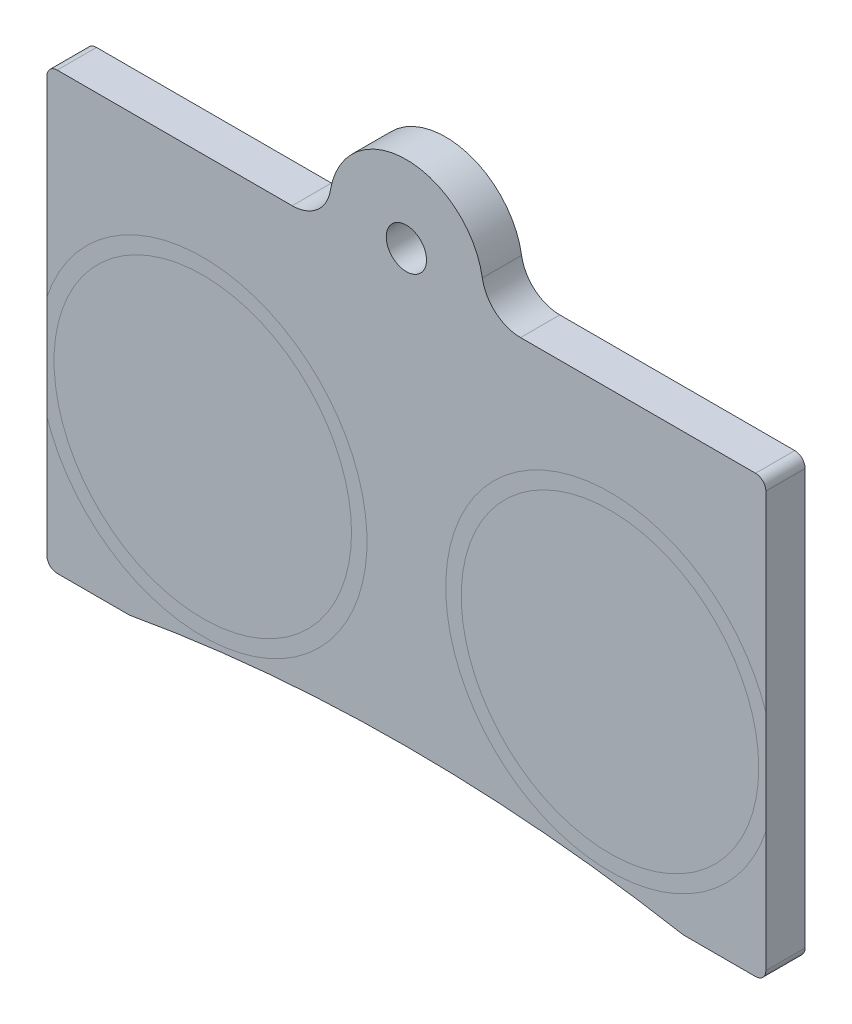
ISO-10303-21;
HEADER;
FILE_DESCRIPTION(('STEP AP214'),'2;1');
FILE_NAME('part.step','',(''),(''),'','','');
FILE_SCHEMA(('AUTOMOTIVE_DESIGN { 1 0 10303 214 1 1 1 1 }'));
ENDSEC;
DATA;
#1=APPLICATION_CONTEXT('core data for automotive mechanical design processes');
#2=APPLICATION_PROTOCOL_DEFINITION('international standard','automotive_design',2000,#1);
#3=PRODUCT_CONTEXT('',#1,'mechanical');
#4=PRODUCT('Part','Part','',(#3));
#5=PRODUCT_RELATED_PRODUCT_CATEGORY('part','',(#4));
#6=PRODUCT_DEFINITION_FORMATION('','',#4);
#7=PRODUCT_DEFINITION_CONTEXT('part definition',#1,'design');
#8=PRODUCT_DEFINITION('design','',#6,#7);
#9=PRODUCT_DEFINITION_SHAPE('','',#8);
#10=(LENGTH_UNIT() NAMED_UNIT(*) SI_UNIT(.MILLI.,.METRE.));
#11=(NAMED_UNIT(*) PLANE_ANGLE_UNIT() SI_UNIT($,.RADIAN.));
#12=(NAMED_UNIT(*) SI_UNIT($,.STERADIAN.) SOLID_ANGLE_UNIT());
#13=UNCERTAINTY_MEASURE_WITH_UNIT(LENGTH_MEASURE(1.E-05),#10,'distance_accuracy_value','');
#14=(GEOMETRIC_REPRESENTATION_CONTEXT(3) GLOBAL_UNCERTAINTY_ASSIGNED_CONTEXT((#13)) GLOBAL_UNIT_ASSIGNED_CONTEXT((#10,
#11,#12)) REPRESENTATION_CONTEXT('',''));
#15=CARTESIAN_POINT('',(0.,0.,0.));
#16=DIRECTION('',(0.,0.,1.));
#17=DIRECTION('',(1.,0.,0.));
#18=AXIS2_PLACEMENT_3D('',#15,#16,#17);
#19=CARTESIAN_POINT('',(-33.8,-43.15,3.8));
#20=DIRECTION('',(0.,0.,1.));
#21=DIRECTION('',(1.,0.,0.));
#22=AXIS2_PLACEMENT_3D('',#19,#20,#21);
#23=PLANE('',#22);
#24=CARTESIAN_POINT('',(0.,0.,3.8));
#25=DIRECTION('',(0.,0.,1.));
#26=DIRECTION('',(1.,0.,0.));
#27=AXIS2_PLACEMENT_3D('',#24,#25,#26);
#28=CIRCLE('',#27,1.95);
#29=CARTESIAN_POINT('',(-1.95,0.,3.8));
#30=VERTEX_POINT('',#29);
#31=EDGE_CURVE('E217',#30,#30,#28,.T.);
#32=ORIENTED_EDGE('',*,*,#31,.F.);
#33=EDGE_LOOP('',(#32));
#34=FACE_BOUND('',#33,.T.);
#35=DIRECTION('',(0.,-1.,0.));
#36=VECTOR('',#35,1.);
#37=CARTESIAN_POINT('',(-34.8,-2.95000000000001,3.8));
#38=LINE('',#37,#36);
#39=CARTESIAN_POINT('',(-34.8,-2.95000000000001,3.8));
#40=VERTEX_POINT('',#39);
#41=CARTESIAN_POINT('',(-34.8,-21.4756703439927,3.8));
#42=VERTEX_POINT('',#41);
#43=EDGE_CURVE('E255',#40,#42,#38,.T.);
#44=ORIENTED_EDGE('',*,*,#43,.T.);
#45=CARTESIAN_POINT('',(-19.71,-26.4858499814908,3.8));
#46=DIRECTION('',(0.,0.,1.));
#47=DIRECTION('',(1.,0.,0.));
#48=AXIS2_PLACEMENT_3D('',#45,#46,#47);
#49=CIRCLE('',#48,15.9);
#50=CARTESIAN_POINT('',(-34.8,-31.4960296189888,3.8));
#51=VERTEX_POINT('',#50);
#52=EDGE_CURVE('E11',#42,#51,#49,.F.);
#53=ORIENTED_EDGE('',*,*,#52,.T.);
#54=CARTESIAN_POINT('',(-34.8,-43.15,3.8));
#55=VERTEX_POINT('',#54);
#56=EDGE_CURVE('E166',#51,#55,#38,.T.);
#57=ORIENTED_EDGE('',*,*,#56,.T.);
#58=CARTESIAN_POINT('',(-33.8,-43.15,3.8));
#59=DIRECTION('',(0.,0.,1.));
#60=DIRECTION('',(1.,0.,0.));
#61=AXIS2_PLACEMENT_3D('',#58,#59,#60);
#62=CIRCLE('',#61,1.);
#63=CARTESIAN_POINT('',(-33.8,-44.15,3.8));
#64=VERTEX_POINT('',#63);
#65=EDGE_CURVE('E163',#55,#64,#62,.T.);
#66=ORIENTED_EDGE('',*,*,#65,.T.);
#67=DIRECTION('',(1.,0.,0.));
#68=VECTOR('',#67,1.);
#69=CARTESIAN_POINT('',(-33.8,-44.15,3.8));
#70=LINE('',#69,#68);
#71=CARTESIAN_POINT('',(-26.8,-44.15,3.8));
#72=VERTEX_POINT('',#71);
#73=EDGE_CURVE('E153',#64,#72,#70,.T.);
#74=ORIENTED_EDGE('',*,*,#73,.T.);
#75=CARTESIAN_POINT('',(0.,-192.583333333334,3.8));
#76=DIRECTION('',(0.,0.,-1.));
#77=DIRECTION('',(-1.,0.,0.));
#78=AXIS2_PLACEMENT_3D('',#75,#76,#77);
#79=CIRCLE('',#78,150.833333333334);
#80=CARTESIAN_POINT('',(26.8,-44.15,3.8));
#81=VERTEX_POINT('',#80);
#82=EDGE_CURVE('E162',#72,#81,#79,.T.);
#83=ORIENTED_EDGE('',*,*,#82,.T.);
#84=DIRECTION('',(1.,0.,0.));
#85=VECTOR('',#84,1.);
#86=CARTESIAN_POINT('',(26.8,-44.15,3.8));
#87=LINE('',#86,#85);
#88=CARTESIAN_POINT('',(33.8,-44.15,3.8));
#89=VERTEX_POINT('',#88);
#90=EDGE_CURVE('E231',#81,#89,#87,.T.);
#91=ORIENTED_EDGE('',*,*,#90,.T.);
#92=CARTESIAN_POINT('',(33.8,-43.15,3.8));
#93=DIRECTION('',(0.,0.,1.));
#94=DIRECTION('',(1.,0.,0.));
#95=AXIS2_PLACEMENT_3D('',#92,#93,#94);
#96=CIRCLE('',#95,1.);
#97=CARTESIAN_POINT('',(34.8,-43.15,3.8));
#98=VERTEX_POINT('',#97);
#99=EDGE_CURVE('E233',#89,#98,#96,.T.);
#100=ORIENTED_EDGE('',*,*,#99,.T.);
#101=DIRECTION('',(0.,1.,0.));
#102=VECTOR('',#101,1.);
#103=CARTESIAN_POINT('',(34.8,-2.95000000000001,3.8));
#104=LINE('',#103,#102);
#105=CARTESIAN_POINT('',(34.8,-31.4960296189888,3.8));
#106=VERTEX_POINT('',#105);
#107=EDGE_CURVE('E236',#98,#106,#104,.T.);
#108=ORIENTED_EDGE('',*,*,#107,.T.);
#109=CARTESIAN_POINT('',(19.71,-26.4858499814908,3.8));
#110=DIRECTION('',(0.,0.,1.));
#111=DIRECTION('',(1.,0.,0.));
#112=AXIS2_PLACEMENT_3D('',#109,#110,#111);
#113=CIRCLE('',#112,15.9);
#114=CARTESIAN_POINT('',(34.8,-21.4756703439927,3.8));
#115=VERTEX_POINT('',#114);
#116=EDGE_CURVE('E174',#106,#115,#113,.F.);
#117=ORIENTED_EDGE('',*,*,#116,.T.);
#118=CARTESIAN_POINT('',(34.8,-2.95000000000001,3.8));
#119=VERTEX_POINT('',#118);
#120=EDGE_CURVE('E235',#115,#119,#104,.T.);
#121=ORIENTED_EDGE('',*,*,#120,.T.);
#122=CARTESIAN_POINT('',(33.8,-2.95,3.8));
#123=DIRECTION('',(0.,0.,1.));
#124=DIRECTION('',(-1.,0.,0.));
#125=AXIS2_PLACEMENT_3D('',#122,#123,#124);
#126=CIRCLE('',#125,1.);
#127=CARTESIAN_POINT('',(33.8,-1.95,3.8));
#128=VERTEX_POINT('',#127);
#129=EDGE_CURVE('E239',#119,#128,#126,.T.);
#130=ORIENTED_EDGE('',*,*,#129,.T.);
#131=DIRECTION('',(-1.,0.,0.));
#132=VECTOR('',#131,1.);
#133=CARTESIAN_POINT('',(11.0544108843484,-1.95,3.8));
#134=LINE('',#133,#132);
#135=CARTESIAN_POINT('',(11.0544108843484,-1.95,3.8));
#136=VERTEX_POINT('',#135);
#137=EDGE_CURVE('E242',#128,#136,#134,.T.);
#138=ORIENTED_EDGE('',*,*,#137,.T.);
#139=CARTESIAN_POINT('',(11.0544108843484,1.8,3.8));
#140=DIRECTION('',(0.,0.,-1.));
#141=DIRECTION('',(1.,0.,0.));
#142=AXIS2_PLACEMENT_3D('',#139,#140,#141);
#143=CIRCLE('',#142,3.75);
#144=CARTESIAN_POINT('',(7.35315724003531,1.19732142857143,3.8));
#145=VERTEX_POINT('',#144);
#146=EDGE_CURVE('E245',#136,#145,#143,.T.);
#147=ORIENTED_EDGE('',*,*,#146,.T.);
#148=CARTESIAN_POINT('',(0.,0.,3.8));
#149=DIRECTION('',(0.,0.,1.));
#150=DIRECTION('',(1.,0.,0.));
#151=AXIS2_PLACEMENT_3D('',#148,#149,#150);
#152=CIRCLE('',#151,7.45);
#153=CARTESIAN_POINT('',(-7.35315724003531,1.19732142857143,3.8));
#154=VERTEX_POINT('',#153);
#155=EDGE_CURVE('E247',#145,#154,#152,.T.);
#156=ORIENTED_EDGE('',*,*,#155,.T.);
#157=CARTESIAN_POINT('',(-11.0544108843484,1.8,3.8));
#158=DIRECTION('',(0.,0.,-1.));
#159=DIRECTION('',(-1.,0.,0.));
#160=AXIS2_PLACEMENT_3D('',#157,#158,#159);
#161=CIRCLE('',#160,3.75);
#162=CARTESIAN_POINT('',(-11.0544108843484,-1.95,3.8));
#163=VERTEX_POINT('',#162);
#164=EDGE_CURVE('E249',#154,#163,#161,.T.);
#165=ORIENTED_EDGE('',*,*,#164,.T.);
#166=DIRECTION('',(-1.,0.,0.));
#167=VECTOR('',#166,1.);
#168=CARTESIAN_POINT('',(-33.8,-1.95,3.8));
#169=LINE('',#168,#167);
#170=CARTESIAN_POINT('',(-33.8,-1.95,3.8));
#171=VERTEX_POINT('',#170);
#172=EDGE_CURVE('E251',#163,#171,#169,.T.);
#173=ORIENTED_EDGE('',*,*,#172,.T.);
#174=CARTESIAN_POINT('',(-33.8,-2.95,3.8));
#175=DIRECTION('',(0.,0.,1.));
#176=DIRECTION('',(1.,0.,0.));
#177=AXIS2_PLACEMENT_3D('',#174,#175,#176);
#178=CIRCLE('',#177,1.);
#179=EDGE_CURVE('E253',#171,#40,#178,.T.);
#180=ORIENTED_EDGE('',*,*,#179,.T.);
#181=EDGE_LOOP('',(#44,#53,#57,#66,#74,#83,#91,#100,#108,#117,#121,#130,#138,#147,#156,#165,
#173,#180));
#182=FACE_BOUND('',#181,.T.);
#183=ADVANCED_FACE('F42',(#34,#182),#23,.T.);
#184=ORIENTED_EDGE('',*,*,#116,.F.);
#185=EDGE_CURVE('E240',#106,#115,#104,.T.);
#186=ORIENTED_EDGE('',*,*,#185,.T.);
#187=EDGE_LOOP('',(#184,#186));
#188=FACE_BOUND('',#187,.T.);
#189=CARTESIAN_POINT('',(19.71,-26.4858499814908,3.8));
#190=DIRECTION('',(0.,0.,1.));
#191=DIRECTION('',(1.,0.,0.));
#192=AXIS2_PLACEMENT_3D('',#189,#190,#191);
#193=CIRCLE('',#192,14.400000029);
#194=CARTESIAN_POINT('',(34.110000029,-26.4858499814908,3.8));
#195=VERTEX_POINT('',#194);
#196=EDGE_CURVE('E51',#195,#195,#193,.F.);
#197=ORIENTED_EDGE('',*,*,#196,.T.);
#198=EDGE_LOOP('',(#197));
#199=FACE_BOUND('',#198,.T.);
#200=ADVANCED_FACE('F193',(#188,#199),#23,.T.);
#201=ORIENTED_EDGE('',*,*,#52,.F.);
#202=EDGE_CURVE('E257',#42,#51,#38,.T.);
#203=ORIENTED_EDGE('',*,*,#202,.T.);
#204=EDGE_LOOP('',(#201,#203));
#205=FACE_BOUND('',#204,.T.);
#206=CARTESIAN_POINT('',(-19.71,-26.4858499814908,3.8));
#207=DIRECTION('',(0.,0.,1.));
#208=DIRECTION('',(1.,0.,0.));
#209=AXIS2_PLACEMENT_3D('',#206,#207,#208);
#210=CIRCLE('',#209,14.400000029);
#211=CARTESIAN_POINT('',(-5.309999971,-26.4858499814908,3.8));
#212=VERTEX_POINT('',#211);
#213=EDGE_CURVE('E177',#212,#212,#210,.F.);
#214=ORIENTED_EDGE('',*,*,#213,.T.);
#215=EDGE_LOOP('',(#214));
#216=FACE_BOUND('',#215,.T.);
#217=ADVANCED_FACE('F206',(#205,#216),#23,.T.);
#218=ORIENTED_EDGE('',*,*,#213,.F.);
#219=EDGE_LOOP('',(#218));
#220=FACE_BOUND('',#219,.T.);
#221=ADVANCED_FACE('F198',(#220),#23,.T.);
#222=ORIENTED_EDGE('',*,*,#196,.F.);
#223=EDGE_LOOP('',(#222));
#224=FACE_BOUND('',#223,.T.);
#225=ADVANCED_FACE('F195',(#224),#23,.T.);
#226=CARTESIAN_POINT('',(-33.8,-43.15,0.));
#227=DIRECTION('',(0.,0.,1.));
#228=DIRECTION('',(1.,0.,0.));
#229=AXIS2_PLACEMENT_3D('',#226,#227,#228);
#230=PLANE('',#229);
#231=CARTESIAN_POINT('',(-33.8,-43.15,0.));
#232=DIRECTION('',(0.,0.,1.));
#233=DIRECTION('',(1.,0.,0.));
#234=AXIS2_PLACEMENT_3D('',#231,#232,#233);
#235=CIRCLE('',#234,1.);
#236=CARTESIAN_POINT('',(-34.8,-43.15,0.));
#237=VERTEX_POINT('',#236);
#238=CARTESIAN_POINT('',(-33.8,-44.15,0.));
#239=VERTEX_POINT('',#238);
#240=EDGE_CURVE('E173',#237,#239,#235,.T.);
#241=ORIENTED_EDGE('',*,*,#240,.F.);
#242=DIRECTION('',(0.,-1.,0.));
#243=VECTOR('',#242,1.);
#244=CARTESIAN_POINT('',(-34.8,-2.95000000000001,0.));
#245=LINE('',#244,#243);
#246=CARTESIAN_POINT('',(-34.8,-2.95000000000001,0.));
#247=VERTEX_POINT('',#246);
#248=EDGE_CURVE('E170',#247,#237,#245,.T.);
#249=ORIENTED_EDGE('',*,*,#248,.F.);
#250=CARTESIAN_POINT('',(-33.8,-2.95,0.));
#251=DIRECTION('',(0.,0.,1.));
#252=DIRECTION('',(1.,0.,0.));
#253=AXIS2_PLACEMENT_3D('',#250,#251,#252);
#254=CIRCLE('',#253,1.);
#255=CARTESIAN_POINT('',(-33.8,-1.95,0.));
#256=VERTEX_POINT('',#255);
#257=EDGE_CURVE('E281',#256,#247,#254,.T.);
#258=ORIENTED_EDGE('',*,*,#257,.F.);
#259=DIRECTION('',(-1.,0.,0.));
#260=VECTOR('',#259,1.);
#261=CARTESIAN_POINT('',(-33.8,-1.95,0.));
#262=LINE('',#261,#260);
#263=CARTESIAN_POINT('',(-11.0544108843484,-1.95,0.));
#264=VERTEX_POINT('',#263);
#265=EDGE_CURVE('E279',#264,#256,#262,.T.);
#266=ORIENTED_EDGE('',*,*,#265,.F.);
#267=CARTESIAN_POINT('',(-11.0544108843484,1.8,0.));
#268=DIRECTION('',(0.,0.,-1.));
#269=DIRECTION('',(-1.,0.,0.));
#270=AXIS2_PLACEMENT_3D('',#267,#268,#269);
#271=CIRCLE('',#270,3.75);
#272=CARTESIAN_POINT('',(-7.35315724003531,1.19732142857143,0.));
#273=VERTEX_POINT('',#272);
#274=EDGE_CURVE('E277',#273,#264,#271,.T.);
#275=ORIENTED_EDGE('',*,*,#274,.F.);
#276=CARTESIAN_POINT('',(0.,0.,0.));
#277=DIRECTION('',(0.,0.,1.));
#278=DIRECTION('',(1.,0.,0.));
#279=AXIS2_PLACEMENT_3D('',#276,#277,#278);
#280=CIRCLE('',#279,7.45);
#281=CARTESIAN_POINT('',(7.35315724003531,1.19732142857143,0.));
#282=VERTEX_POINT('',#281);
#283=EDGE_CURVE('E275',#282,#273,#280,.T.);
#284=ORIENTED_EDGE('',*,*,#283,.F.);
#285=CARTESIAN_POINT('',(11.0544108843484,1.8,0.));
#286=DIRECTION('',(0.,0.,-1.));
#287=DIRECTION('',(1.,0.,0.));
#288=AXIS2_PLACEMENT_3D('',#285,#286,#287);
#289=CIRCLE('',#288,3.75);
#290=CARTESIAN_POINT('',(11.0544108843484,-1.95,0.));
#291=VERTEX_POINT('',#290);
#292=EDGE_CURVE('E273',#291,#282,#289,.T.);
#293=ORIENTED_EDGE('',*,*,#292,.F.);
#294=DIRECTION('',(-1.,0.,0.));
#295=VECTOR('',#294,1.);
#296=CARTESIAN_POINT('',(11.0544108843484,-1.95,0.));
#297=LINE('',#296,#295);
#298=CARTESIAN_POINT('',(33.8,-1.95,0.));
#299=VERTEX_POINT('',#298);
#300=EDGE_CURVE('E271',#299,#291,#297,.T.);
#301=ORIENTED_EDGE('',*,*,#300,.F.);
#302=CARTESIAN_POINT('',(33.8,-2.95,0.));
#303=DIRECTION('',(0.,0.,1.));
#304=DIRECTION('',(-1.,0.,0.));
#305=AXIS2_PLACEMENT_3D('',#302,#303,#304);
#306=CIRCLE('',#305,1.);
#307=CARTESIAN_POINT('',(34.8,-2.95000000000001,0.));
#308=VERTEX_POINT('',#307);
#309=EDGE_CURVE('E269',#308,#299,#306,.T.);
#310=ORIENTED_EDGE('',*,*,#309,.F.);
#311=DIRECTION('',(0.,1.,0.));
#312=VECTOR('',#311,1.);
#313=CARTESIAN_POINT('',(34.8,-2.95000000000001,0.));
#314=LINE('',#313,#312);
#315=CARTESIAN_POINT('',(34.8,-43.15,0.));
#316=VERTEX_POINT('',#315);
#317=EDGE_CURVE('E267',#316,#308,#314,.T.);
#318=ORIENTED_EDGE('',*,*,#317,.F.);
#319=CARTESIAN_POINT('',(33.8,-43.15,0.));
#320=DIRECTION('',(0.,0.,1.));
#321=DIRECTION('',(1.,0.,0.));
#322=AXIS2_PLACEMENT_3D('',#319,#320,#321);
#323=CIRCLE('',#322,1.);
#324=CARTESIAN_POINT('',(33.8,-44.15,0.));
#325=VERTEX_POINT('',#324);
#326=EDGE_CURVE('E265',#325,#316,#323,.T.);
#327=ORIENTED_EDGE('',*,*,#326,.F.);
#328=DIRECTION('',(1.,0.,0.));
#329=VECTOR('',#328,1.);
#330=CARTESIAN_POINT('',(26.8,-44.15,0.));
#331=LINE('',#330,#329);
#332=CARTESIAN_POINT('',(26.8,-44.15,0.));
#333=VERTEX_POINT('',#332);
#334=EDGE_CURVE('E263',#333,#325,#331,.T.);
#335=ORIENTED_EDGE('',*,*,#334,.F.);
#336=CARTESIAN_POINT('',(0.,-192.583333333334,0.));
#337=DIRECTION('',(0.,0.,-1.));
#338=DIRECTION('',(-1.,0.,0.));
#339=AXIS2_PLACEMENT_3D('',#336,#337,#338);
#340=CIRCLE('',#339,150.833333333334);
#341=CARTESIAN_POINT('',(-26.8,-44.15,0.));
#342=VERTEX_POINT('',#341);
#343=EDGE_CURVE('E260',#342,#333,#340,.T.);
#344=ORIENTED_EDGE('',*,*,#343,.F.);
#345=DIRECTION('',(1.,0.,0.));
#346=VECTOR('',#345,1.);
#347=CARTESIAN_POINT('',(-33.8,-44.15,0.));
#348=LINE('',#347,#346);
#349=EDGE_CURVE('E224',#239,#342,#348,.T.);
#350=ORIENTED_EDGE('',*,*,#349,.F.);
#351=EDGE_LOOP('',(#241,#249,#258,#266,#275,#284,#293,#301,#310,#318,#327,#335,#344,#350));
#352=FACE_BOUND('',#351,.T.);
#353=CARTESIAN_POINT('',(0.,0.,0.));
#354=DIRECTION('',(0.,0.,1.));
#355=DIRECTION('',(1.,0.,0.));
#356=AXIS2_PLACEMENT_3D('',#353,#354,#355);
#357=CIRCLE('',#356,1.95);
#358=CARTESIAN_POINT('',(-1.95,0.,0.));
#359=VERTEX_POINT('',#358);
#360=EDGE_CURVE('E220',#359,#359,#357,.T.);
#361=ORIENTED_EDGE('',*,*,#360,.T.);
#362=EDGE_LOOP('',(#361));
#363=FACE_BOUND('',#362,.T.);
#364=ADVANCED_FACE('F197',(#352,#363),#230,.F.);
#365=CARTESIAN_POINT('',(-33.8,-43.15,3.8));
#366=DIRECTION('',(0.,0.,-1.));
#367=DIRECTION('',(-1.,0.,0.));
#368=AXIS2_PLACEMENT_3D('',#365,#366,#367);
#369=CYLINDRICAL_SURFACE('',#368,1.);
#370=ORIENTED_EDGE('',*,*,#240,.T.);
#371=DIRECTION('',(0.,0.,-1.));
#372=VECTOR('',#371,1.);
#373=CARTESIAN_POINT('',(-33.8,-44.15,3.8));
#374=LINE('',#373,#372);
#375=EDGE_CURVE('E157',#64,#239,#374,.T.);
#376=ORIENTED_EDGE('',*,*,#375,.F.);
#377=ORIENTED_EDGE('',*,*,#65,.F.);
#378=DIRECTION('',(0.,0.,-1.));
#379=VECTOR('',#378,1.);
#380=CARTESIAN_POINT('',(-34.8,-43.15,3.8));
#381=LINE('',#380,#379);
#382=EDGE_CURVE('E256',#55,#237,#381,.T.);
#383=ORIENTED_EDGE('',*,*,#382,.T.);
#384=EDGE_LOOP('',(#370,#376,#377,#383));
#385=FACE_BOUND('',#384,.T.);
#386=ADVANCED_FACE('F44',(#385),#369,.T.);
#387=CARTESIAN_POINT('',(-33.8,-44.15,3.8));
#388=DIRECTION('',(0.,1.,0.));
#389=DIRECTION('',(0.,0.,1.));
#390=AXIS2_PLACEMENT_3D('',#387,#388,#389);
#391=PLANE('',#390);
#392=ORIENTED_EDGE('',*,*,#349,.T.);
#393=DIRECTION('',(0.,0.,-1.));
#394=VECTOR('',#393,1.);
#395=CARTESIAN_POINT('',(-26.8,-44.15,3.8));
#396=LINE('',#395,#394);
#397=EDGE_CURVE('E160',#72,#342,#396,.T.);
#398=ORIENTED_EDGE('',*,*,#397,.F.);
#399=ORIENTED_EDGE('',*,*,#73,.F.);
#400=ORIENTED_EDGE('',*,*,#375,.T.);
#401=EDGE_LOOP('',(#392,#398,#399,#400));
#402=FACE_BOUND('',#401,.T.);
#403=ADVANCED_FACE('F155',(#402),#391,.F.);
#404=CARTESIAN_POINT('',(0.,-192.583333333334,3.8));
#405=DIRECTION('',(0.,0.,-1.));
#406=DIRECTION('',(-1.,0.,0.));
#407=AXIS2_PLACEMENT_3D('',#404,#405,#406);
#408=CYLINDRICAL_SURFACE('',#407,150.833333333334);
#409=ORIENTED_EDGE('',*,*,#343,.T.);
#410=DIRECTION('',(0.,0.,-1.));
#411=VECTOR('',#410,1.);
#412=CARTESIAN_POINT('',(26.8,-44.15,3.8));
#413=LINE('',#412,#411);
#414=EDGE_CURVE('E179',#81,#333,#413,.T.);
#415=ORIENTED_EDGE('',*,*,#414,.F.);
#416=ORIENTED_EDGE('',*,*,#82,.F.);
#417=ORIENTED_EDGE('',*,*,#397,.T.);
#418=EDGE_LOOP('',(#409,#415,#416,#417));
#419=FACE_BOUND('',#418,.T.);
#420=ADVANCED_FACE('F338',(#419),#408,.F.);
#421=CARTESIAN_POINT('',(26.8,-44.15,3.8));
#422=DIRECTION('',(0.,1.,0.));
#423=DIRECTION('',(-1.,0.,0.));
#424=AXIS2_PLACEMENT_3D('',#421,#422,#423);
#425=PLANE('',#424);
#426=ORIENTED_EDGE('',*,*,#334,.T.);
#427=DIRECTION('',(0.,0.,-1.));
#428=VECTOR('',#427,1.);
#429=CARTESIAN_POINT('',(33.8,-44.15,3.8));
#430=LINE('',#429,#428);
#431=EDGE_CURVE('E312',#89,#325,#430,.T.);
#432=ORIENTED_EDGE('',*,*,#431,.F.);
#433=ORIENTED_EDGE('',*,*,#90,.F.);
#434=ORIENTED_EDGE('',*,*,#414,.T.);
#435=EDGE_LOOP('',(#426,#432,#433,#434));
#436=FACE_BOUND('',#435,.T.);
#437=ADVANCED_FACE('F319',(#436),#425,.F.);
#438=CARTESIAN_POINT('',(33.8,-43.15,3.8));
#439=DIRECTION('',(0.,0.,-1.));
#440=DIRECTION('',(-1.,0.,0.));
#441=AXIS2_PLACEMENT_3D('',#438,#439,#440);
#442=CYLINDRICAL_SURFACE('',#441,1.);
#443=ORIENTED_EDGE('',*,*,#326,.T.);
#444=DIRECTION('',(0.,0.,-1.));
#445=VECTOR('',#444,1.);
#446=CARTESIAN_POINT('',(34.8,-43.15,3.8));
#447=LINE('',#446,#445);
#448=EDGE_CURVE('E309',#98,#316,#447,.T.);
#449=ORIENTED_EDGE('',*,*,#448,.F.);
#450=ORIENTED_EDGE('',*,*,#99,.F.);
#451=ORIENTED_EDGE('',*,*,#431,.T.);
#452=EDGE_LOOP('',(#443,#449,#450,#451));
#453=FACE_BOUND('',#452,.T.);
#454=ADVANCED_FACE('F329',(#453),#442,.T.);
#455=CARTESIAN_POINT('',(34.8,-2.95000000000001,3.8));
#456=DIRECTION('',(-1.,0.,0.));
#457=DIRECTION('',(0.,-1.,0.));
#458=AXIS2_PLACEMENT_3D('',#455,#456,#457);
#459=PLANE('',#458);
#460=ORIENTED_EDGE('',*,*,#317,.T.);
#461=DIRECTION('',(0.,0.,-1.));
#462=VECTOR('',#461,1.);
#463=CARTESIAN_POINT('',(34.8,-2.95000000000001,3.8));
#464=LINE('',#463,#462);
#465=EDGE_CURVE('E306',#119,#308,#464,.T.);
#466=ORIENTED_EDGE('',*,*,#465,.F.);
#467=ORIENTED_EDGE('',*,*,#120,.F.);
#468=ORIENTED_EDGE('',*,*,#185,.F.);
#469=ORIENTED_EDGE('',*,*,#107,.F.);
#470=ORIENTED_EDGE('',*,*,#448,.T.);
#471=EDGE_LOOP('',(#460,#466,#467,#468,#469,#470));
#472=FACE_BOUND('',#471,.T.);
#473=ADVANCED_FACE('F333',(#472),#459,.F.);
#474=CARTESIAN_POINT('',(33.8,-2.95,3.8));
#475=DIRECTION('',(0.,0.,-1.));
#476=DIRECTION('',(-1.,0.,0.));
#477=AXIS2_PLACEMENT_3D('',#474,#475,#476);
#478=CYLINDRICAL_SURFACE('',#477,1.);
#479=ORIENTED_EDGE('',*,*,#309,.T.);
#480=DIRECTION('',(0.,0.,-1.));
#481=VECTOR('',#480,1.);
#482=CARTESIAN_POINT('',(33.8,-1.95,3.8));
#483=LINE('',#482,#481);
#484=EDGE_CURVE('E303',#128,#299,#483,.T.);
#485=ORIENTED_EDGE('',*,*,#484,.F.);
#486=ORIENTED_EDGE('',*,*,#129,.F.);
#487=ORIENTED_EDGE('',*,*,#465,.T.);
#488=EDGE_LOOP('',(#479,#485,#486,#487));
#489=FACE_BOUND('',#488,.T.);
#490=ADVANCED_FACE('F351',(#489),#478,.T.);
#491=CARTESIAN_POINT('',(11.0544108843484,-1.95,3.8));
#492=DIRECTION('',(0.,-1.,0.));
#493=DIRECTION('',(0.,0.,-1.));
#494=AXIS2_PLACEMENT_3D('',#491,#492,#493);
#495=PLANE('',#494);
#496=ORIENTED_EDGE('',*,*,#300,.T.);
#497=DIRECTION('',(0.,0.,-1.));
#498=VECTOR('',#497,1.);
#499=CARTESIAN_POINT('',(11.0544108843484,-1.95,3.8));
#500=LINE('',#499,#498);
#501=EDGE_CURVE('E300',#136,#291,#500,.T.);
#502=ORIENTED_EDGE('',*,*,#501,.F.);
#503=ORIENTED_EDGE('',*,*,#137,.F.);
#504=ORIENTED_EDGE('',*,*,#484,.T.);
#505=EDGE_LOOP('',(#496,#502,#503,#504));
#506=FACE_BOUND('',#505,.T.);
#507=ADVANCED_FACE('F354',(#506),#495,.F.);
#508=CARTESIAN_POINT('',(11.0544108843484,1.8,3.8));
#509=DIRECTION('',(0.,0.,-1.));
#510=DIRECTION('',(-1.,0.,0.));
#511=AXIS2_PLACEMENT_3D('',#508,#509,#510);
#512=CYLINDRICAL_SURFACE('',#511,3.75);
#513=ORIENTED_EDGE('',*,*,#292,.T.);
#514=DIRECTION('',(0.,0.,-1.));
#515=VECTOR('',#514,1.);
#516=CARTESIAN_POINT('',(7.35315724003531,1.19732142857143,3.8));
#517=LINE('',#516,#515);
#518=EDGE_CURVE('E297',#145,#282,#517,.T.);
#519=ORIENTED_EDGE('',*,*,#518,.F.);
#520=ORIENTED_EDGE('',*,*,#146,.F.);
#521=ORIENTED_EDGE('',*,*,#501,.T.);
#522=EDGE_LOOP('',(#513,#519,#520,#521));
#523=FACE_BOUND('',#522,.T.);
#524=ADVANCED_FACE('F358',(#523),#512,.F.);
#525=CARTESIAN_POINT('',(0.,0.,3.8));
#526=DIRECTION('',(0.,0.,-1.));
#527=DIRECTION('',(-1.,0.,0.));
#528=AXIS2_PLACEMENT_3D('',#525,#526,#527);
#529=CYLINDRICAL_SURFACE('',#528,7.45);
#530=ORIENTED_EDGE('',*,*,#283,.T.);
#531=DIRECTION('',(0.,0.,-1.));
#532=VECTOR('',#531,1.);
#533=CARTESIAN_POINT('',(-7.35315724003531,1.19732142857143,3.8));
#534=LINE('',#533,#532);
#535=EDGE_CURVE('E294',#154,#273,#534,.T.);
#536=ORIENTED_EDGE('',*,*,#535,.F.);
#537=ORIENTED_EDGE('',*,*,#155,.F.);
#538=ORIENTED_EDGE('',*,*,#518,.T.);
#539=EDGE_LOOP('',(#530,#536,#537,#538));
#540=FACE_BOUND('',#539,.T.);
#541=ADVANCED_FACE('F362',(#540),#529,.T.);
#542=CARTESIAN_POINT('',(-11.0544108843484,1.8,3.8));
#543=DIRECTION('',(0.,0.,-1.));
#544=DIRECTION('',(-1.,0.,0.));
#545=AXIS2_PLACEMENT_3D('',#542,#543,#544);
#546=CYLINDRICAL_SURFACE('',#545,3.75);
#547=ORIENTED_EDGE('',*,*,#274,.T.);
#548=DIRECTION('',(0.,0.,-1.));
#549=VECTOR('',#548,1.);
#550=CARTESIAN_POINT('',(-11.0544108843484,-1.95,3.8));
#551=LINE('',#550,#549);
#552=EDGE_CURVE('E291',#163,#264,#551,.T.);
#553=ORIENTED_EDGE('',*,*,#552,.F.);
#554=ORIENTED_EDGE('',*,*,#164,.F.);
#555=ORIENTED_EDGE('',*,*,#535,.T.);
#556=EDGE_LOOP('',(#547,#553,#554,#555));
#557=FACE_BOUND('',#556,.T.);
#558=ADVANCED_FACE('F366',(#557),#546,.F.);
#559=CARTESIAN_POINT('',(-33.8,-1.95,3.8));
#560=DIRECTION('',(0.,-1.,0.));
#561=DIRECTION('',(0.,0.,-1.));
#562=AXIS2_PLACEMENT_3D('',#559,#560,#561);
#563=PLANE('',#562);
#564=ORIENTED_EDGE('',*,*,#265,.T.);
#565=DIRECTION('',(0.,0.,-1.));
#566=VECTOR('',#565,1.);
#567=CARTESIAN_POINT('',(-33.8,-1.95,3.8));
#568=LINE('',#567,#566);
#569=EDGE_CURVE('E288',#171,#256,#568,.T.);
#570=ORIENTED_EDGE('',*,*,#569,.F.);
#571=ORIENTED_EDGE('',*,*,#172,.F.);
#572=ORIENTED_EDGE('',*,*,#552,.T.);
#573=EDGE_LOOP('',(#564,#570,#571,#572));
#574=FACE_BOUND('',#573,.T.);
#575=ADVANCED_FACE('F370',(#574),#563,.F.);
#576=CARTESIAN_POINT('',(-33.8,-2.95,3.8));
#577=DIRECTION('',(0.,0.,-1.));
#578=DIRECTION('',(-1.,0.,0.));
#579=AXIS2_PLACEMENT_3D('',#576,#577,#578);
#580=CYLINDRICAL_SURFACE('',#579,1.);
#581=ORIENTED_EDGE('',*,*,#257,.T.);
#582=DIRECTION('',(0.,0.,-1.));
#583=VECTOR('',#582,1.);
#584=CARTESIAN_POINT('',(-34.8,-2.95000000000001,3.8));
#585=LINE('',#584,#583);
#586=EDGE_CURVE('E285',#40,#247,#585,.T.);
#587=ORIENTED_EDGE('',*,*,#586,.F.);
#588=ORIENTED_EDGE('',*,*,#179,.F.);
#589=ORIENTED_EDGE('',*,*,#569,.T.);
#590=EDGE_LOOP('',(#581,#587,#588,#589));
#591=FACE_BOUND('',#590,.T.);
#592=ADVANCED_FACE('F374',(#591),#580,.T.);
#593=CARTESIAN_POINT('',(-34.8,-2.95000000000001,3.8));
#594=DIRECTION('',(1.,0.,0.));
#595=DIRECTION('',(0.,1.,0.));
#596=AXIS2_PLACEMENT_3D('',#593,#594,#595);
#597=PLANE('',#596);
#598=ORIENTED_EDGE('',*,*,#248,.T.);
#599=ORIENTED_EDGE('',*,*,#382,.F.);
#600=ORIENTED_EDGE('',*,*,#56,.F.);
#601=ORIENTED_EDGE('',*,*,#202,.F.);
#602=ORIENTED_EDGE('',*,*,#43,.F.);
#603=ORIENTED_EDGE('',*,*,#586,.T.);
#604=EDGE_LOOP('',(#598,#599,#600,#601,#602,#603));
#605=FACE_BOUND('',#604,.T.);
#606=ADVANCED_FACE('F378',(#605),#597,.F.);
#607=CARTESIAN_POINT('',(0.,0.,3.8));
#608=DIRECTION('',(0.,0.,-1.));
#609=DIRECTION('',(-1.,0.,0.));
#610=AXIS2_PLACEMENT_3D('',#607,#608,#609);
#611=CYLINDRICAL_SURFACE('',#610,1.95);
#612=CARTESIAN_POINT('',(-1.95,0.,3.8));
#613=CARTESIAN_POINT('',(-1.95,0.,3.76041666666667));
#614=CARTESIAN_POINT('',(-1.95,0.,3.72083333333333));
#615=CARTESIAN_POINT('',(-1.95,0.,3.64166666666667));
#616=CARTESIAN_POINT('',(-1.95,0.,3.60208333333333));
#617=CARTESIAN_POINT('',(-1.95,0.,3.52291666666667));
#618=CARTESIAN_POINT('',(-1.95,0.,3.48333333333333));
#619=CARTESIAN_POINT('',(-1.95,0.,3.40416666666667));
#620=CARTESIAN_POINT('',(-1.95,0.,3.36458333333333));
#621=CARTESIAN_POINT('',(-1.95,0.,3.28541666666667));
#622=CARTESIAN_POINT('',(-1.95,0.,3.24583333333333));
#623=CARTESIAN_POINT('',(-1.95,0.,3.16666666666667));
#624=CARTESIAN_POINT('',(-1.95,0.,3.12708333333333));
#625=CARTESIAN_POINT('',(-1.95,0.,3.04791666666667));
#626=CARTESIAN_POINT('',(-1.95,0.,3.00833333333333));
#627=CARTESIAN_POINT('',(-1.95,0.,2.92916666666667));
#628=CARTESIAN_POINT('',(-1.95,0.,2.88958333333333));
#629=CARTESIAN_POINT('',(-1.95,0.,2.81041666666667));
#630=CARTESIAN_POINT('',(-1.95,0.,2.77083333333333));
#631=CARTESIAN_POINT('',(-1.95,0.,2.69166666666667));
#632=CARTESIAN_POINT('',(-1.95,0.,2.65208333333333));
#633=CARTESIAN_POINT('',(-1.95,0.,2.57291666666667));
#634=CARTESIAN_POINT('',(-1.95,0.,2.53333333333333));
#635=CARTESIAN_POINT('',(-1.95,0.,2.45416666666667));
#636=CARTESIAN_POINT('',(-1.95,0.,2.41458333333333));
#637=CARTESIAN_POINT('',(-1.95,0.,2.33541666666667));
#638=CARTESIAN_POINT('',(-1.95,0.,2.29583333333333));
#639=CARTESIAN_POINT('',(-1.95,0.,2.21666666666667));
#640=CARTESIAN_POINT('',(-1.95,0.,2.17708333333333));
#641=CARTESIAN_POINT('',(-1.95,0.,2.09791666666667));
#642=CARTESIAN_POINT('',(-1.95,0.,2.05833333333333));
#643=CARTESIAN_POINT('',(-1.95,0.,1.97916666666667));
#644=CARTESIAN_POINT('',(-1.95,0.,1.93958333333333));
#645=CARTESIAN_POINT('',(-1.95,0.,1.86041666666667));
#646=CARTESIAN_POINT('',(-1.95,0.,1.82083333333333));
#647=CARTESIAN_POINT('',(-1.95,0.,1.74166666666667));
#648=CARTESIAN_POINT('',(-1.95,0.,1.70208333333333));
#649=CARTESIAN_POINT('',(-1.95,0.,1.62291666666667));
#650=CARTESIAN_POINT('',(-1.95,0.,1.58333333333333));
#651=CARTESIAN_POINT('',(-1.95,0.,1.50416666666667));
#652=CARTESIAN_POINT('',(-1.95,0.,1.46458333333333));
#653=CARTESIAN_POINT('',(-1.95,0.,1.38541666666667));
#654=CARTESIAN_POINT('',(-1.95,0.,1.34583333333333));
#655=CARTESIAN_POINT('',(-1.95,0.,1.26666666666667));
#656=CARTESIAN_POINT('',(-1.95,0.,1.22708333333333));
#657=CARTESIAN_POINT('',(-1.95,0.,1.14791666666667));
#658=CARTESIAN_POINT('',(-1.95,0.,1.10833333333333));
#659=CARTESIAN_POINT('',(-1.95,0.,1.02916666666667));
#660=CARTESIAN_POINT('',(-1.95,0.,0.989583333333333));
#661=CARTESIAN_POINT('',(-1.95,0.,0.910416666666667));
#662=CARTESIAN_POINT('',(-1.95,0.,0.870833333333333));
#663=CARTESIAN_POINT('',(-1.95,0.,0.791666666666667));
#664=CARTESIAN_POINT('',(-1.95,0.,0.752083333333333));
#665=CARTESIAN_POINT('',(-1.95,0.,0.672916666666667));
#666=CARTESIAN_POINT('',(-1.95,0.,0.633333333333333));
#667=CARTESIAN_POINT('',(-1.95,0.,0.554166666666667));
#668=CARTESIAN_POINT('',(-1.95,0.,0.514583333333334));
#669=CARTESIAN_POINT('',(-1.95,0.,0.435416666666667));
#670=CARTESIAN_POINT('',(-1.95,0.,0.395833333333333));
#671=CARTESIAN_POINT('',(-1.95,0.,0.316666666666666));
#672=CARTESIAN_POINT('',(-1.95,0.,0.277083333333333));
#673=CARTESIAN_POINT('',(-1.95,0.,0.197916666666667));
#674=CARTESIAN_POINT('',(-1.95,0.,0.158333333333333));
#675=CARTESIAN_POINT('',(-1.95,0.,0.0791666666666666));
#676=CARTESIAN_POINT('',(-1.95,0.,0.0395833333333333));
#677=CARTESIAN_POINT('',(-1.95,0.,0.));
#678=B_SPLINE_CURVE_WITH_KNOTS('',3,(#612,#613,#614,#615,#616,#617,#618,#619,#620,#621,#622,
#623,#624,#625,#626,#627,#628,#629,#630,#631,#632,#633,#634,#635,#636,#637,#638,#639,#640,#641,
#642,#643,#644,#645,#646,#647,#648,#649,#650,#651,#652,#653,#654,#655,#656,#657,#658,#659,#660,
#661,#662,#663,#664,#665,#666,#667,#668,#669,#670,#671,#672,#673,#674,#675,#676,#677),
.UNSPECIFIED.,.F.,.F.,(4,2,2,2,2,2,2,2,2,2,2,2,2,2,2,2,2,2,2,2,2,2,2,2,2,2,2,2,2,2,2,2,4),(0.,
0.11875,0.2375,0.35625,0.475,0.59375,0.7125,0.831249999999999,0.95,1.06875,1.1875,1.30625,1.425,
1.54375,1.6625,1.78125,1.9,2.01875,2.1375,2.25625,2.375,2.49375,2.6125,2.73125,2.85,2.96875,
3.0875,3.20625,3.325,3.44375,3.5625,3.68125,3.8),.UNSPECIFIED.);
#679=EDGE_CURVE('BSEAM381',#30,#359,#678,.T.);
#680=ORIENTED_EDGE('',*,*,#31,.T.);
#681=ORIENTED_EDGE('',*,*,#360,.F.);
#682=ORIENTED_EDGE('',*,*,#679,.T.);
#683=ORIENTED_EDGE('',*,*,#679,.F.);
#684=EDGE_LOOP('',(#680,#682,#681,#683));
#685=FACE_BOUND('',#684,.T.);
#686=ADVANCED_FACE('F381',(#685),#611,.F.);
#687=CLOSED_SHELL('',(#183,#200,#217,#221,#225,#364,#386,#403,#420,#437,#454,#473,#490,#507,
#524,#541,#558,#575,#592,#606,#686));
#688=MANIFOLD_SOLID_BREP('B2',#687);
#689=ADVANCED_BREP_SHAPE_REPRESENTATION('',(#18,#688),#14);
#690=SHAPE_DEFINITION_REPRESENTATION(#9,#689);
ENDSEC;
END-ISO-10303-21;
